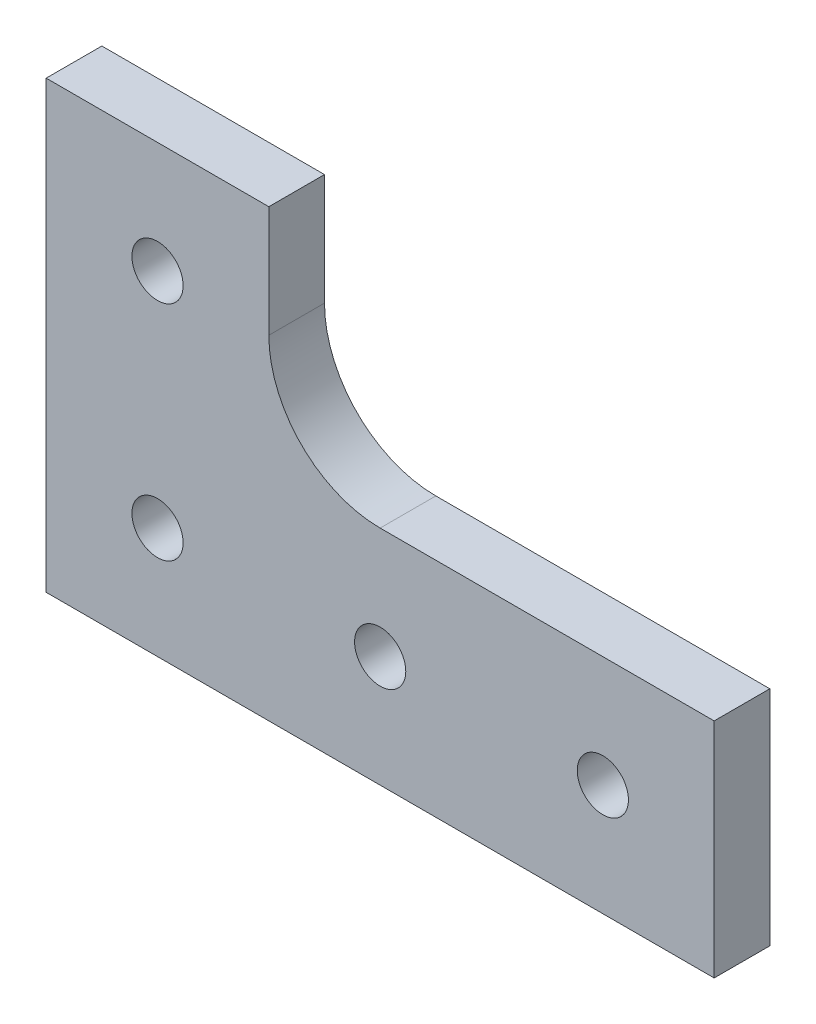
ISO-10303-21;
HEADER;
FILE_DESCRIPTION(('STEP AP214'),'2;1');
FILE_NAME('part.step','',(''),(''),'','','');
FILE_SCHEMA(('AUTOMOTIVE_DESIGN { 1 0 10303 214 1 1 1 1 }'));
ENDSEC;
DATA;
#1=APPLICATION_CONTEXT('core data for automotive mechanical design processes');
#2=APPLICATION_PROTOCOL_DEFINITION('international standard','automotive_design',2000,#1);
#3=PRODUCT_CONTEXT('',#1,'mechanical');
#4=PRODUCT('Part','Part','',(#3));
#5=PRODUCT_RELATED_PRODUCT_CATEGORY('part','',(#4));
#6=PRODUCT_DEFINITION_FORMATION('','',#4);
#7=PRODUCT_DEFINITION_CONTEXT('part definition',#1,'design');
#8=PRODUCT_DEFINITION('design','',#6,#7);
#9=PRODUCT_DEFINITION_SHAPE('','',#8);
#10=(LENGTH_UNIT() NAMED_UNIT(*) SI_UNIT(.MILLI.,.METRE.));
#11=(NAMED_UNIT(*) PLANE_ANGLE_UNIT() SI_UNIT($,.RADIAN.));
#12=(NAMED_UNIT(*) SI_UNIT($,.STERADIAN.) SOLID_ANGLE_UNIT());
#13=UNCERTAINTY_MEASURE_WITH_UNIT(LENGTH_MEASURE(1.E-05),#10,'distance_accuracy_value','');
#14=(GEOMETRIC_REPRESENTATION_CONTEXT(3) GLOBAL_UNCERTAINTY_ASSIGNED_CONTEXT((#13)) GLOBAL_UNIT_ASSIGNED_CONTEXT((#10,
#11,#12)) REPRESENTATION_CONTEXT('',''));
#15=CARTESIAN_POINT('',(0.,0.,0.));
#16=DIRECTION('',(0.,0.,1.));
#17=DIRECTION('',(1.,0.,0.));
#18=AXIS2_PLACEMENT_3D('',#15,#16,#17);
#19=CARTESIAN_POINT('',(76.2,0.,6.35));
#20=DIRECTION('',(0.,1.,0.));
#21=DIRECTION('',(-1.,0.,0.));
#22=AXIS2_PLACEMENT_3D('',#19,#20,#21);
#23=PLANE('',#22);
#24=DIRECTION('',(1.,0.,0.));
#25=VECTOR('',#24,1.);
#26=CARTESIAN_POINT('',(76.2,0.,0.));
#27=LINE('',#26,#25);
#28=CARTESIAN_POINT('',(0.,0.,0.));
#29=VERTEX_POINT('',#28);
#30=CARTESIAN_POINT('',(76.2,0.,0.));
#31=VERTEX_POINT('',#30);
#32=EDGE_CURVE('E123',#29,#31,#27,.T.);
#33=ORIENTED_EDGE('',*,*,#32,.T.);
#34=DIRECTION('',(0.,0.,-1.));
#35=VECTOR('',#34,1.);
#36=CARTESIAN_POINT('',(76.2,0.,6.35));
#37=LINE('',#36,#35);
#38=CARTESIAN_POINT('',(76.2,0.,6.35));
#39=VERTEX_POINT('',#38);
#40=EDGE_CURVE('E103',#39,#31,#37,.T.);
#41=ORIENTED_EDGE('',*,*,#40,.F.);
#42=DIRECTION('',(1.,0.,0.));
#43=VECTOR('',#42,1.);
#44=CARTESIAN_POINT('',(76.2,0.,6.35));
#45=LINE('',#44,#43);
#46=CARTESIAN_POINT('',(0.,0.,6.35));
#47=VERTEX_POINT('',#46);
#48=EDGE_CURVE('E110',#47,#39,#45,.T.);
#49=ORIENTED_EDGE('',*,*,#48,.F.);
#50=DIRECTION('',(0.,0.,-1.));
#51=VECTOR('',#50,1.);
#52=CARTESIAN_POINT('',(0.,0.,6.35));
#53=LINE('',#52,#51);
#54=EDGE_CURVE('E144',#47,#29,#53,.T.);
#55=ORIENTED_EDGE('',*,*,#54,.T.);
#56=EDGE_LOOP('',(#33,#41,#49,#55));
#57=FACE_BOUND('',#56,.T.);
#58=ADVANCED_FACE('F39',(#57),#23,.F.);
#59=CARTESIAN_POINT('',(76.2,25.4,6.35));
#60=DIRECTION('',(-1.,0.,0.));
#61=DIRECTION('',(0.,0.,1.));
#62=AXIS2_PLACEMENT_3D('',#59,#60,#61);
#63=PLANE('',#62);
#64=DIRECTION('',(0.,1.,0.));
#65=VECTOR('',#64,1.);
#66=CARTESIAN_POINT('',(76.2,25.4,0.));
#67=LINE('',#66,#65);
#68=CARTESIAN_POINT('',(76.2,25.4,0.));
#69=VERTEX_POINT('',#68);
#70=EDGE_CURVE('E158',#31,#69,#67,.T.);
#71=ORIENTED_EDGE('',*,*,#70,.T.);
#72=DIRECTION('',(0.,0.,-1.));
#73=VECTOR('',#72,1.);
#74=CARTESIAN_POINT('',(76.2,25.4,6.35));
#75=LINE('',#74,#73);
#76=CARTESIAN_POINT('',(76.2,25.4,6.35));
#77=VERTEX_POINT('',#76);
#78=EDGE_CURVE('E106',#77,#69,#75,.T.);
#79=ORIENTED_EDGE('',*,*,#78,.F.);
#80=DIRECTION('',(0.,1.,0.));
#81=VECTOR('',#80,1.);
#82=CARTESIAN_POINT('',(76.2,25.4,6.35));
#83=LINE('',#82,#81);
#84=EDGE_CURVE('E99',#39,#77,#83,.T.);
#85=ORIENTED_EDGE('',*,*,#84,.F.);
#86=ORIENTED_EDGE('',*,*,#40,.T.);
#87=EDGE_LOOP('',(#71,#79,#85,#86));
#88=FACE_BOUND('',#87,.T.);
#89=ADVANCED_FACE('F101',(#88),#63,.F.);
#90=CARTESIAN_POINT('',(25.4,25.4,6.35));
#91=DIRECTION('',(0.,-1.,0.));
#92=DIRECTION('',(1.,0.,0.));
#93=AXIS2_PLACEMENT_3D('',#90,#91,#92);
#94=PLANE('',#93);
#95=DIRECTION('',(-1.,0.,0.));
#96=VECTOR('',#95,1.);
#97=CARTESIAN_POINT('',(25.4,25.4,0.));
#98=LINE('',#97,#96);
#99=CARTESIAN_POINT('',(38.1,25.4,0.));
#100=VERTEX_POINT('',#99);
#101=EDGE_CURVE('E155',#69,#100,#98,.T.);
#102=ORIENTED_EDGE('',*,*,#101,.T.);
#103=DIRECTION('',(0.,0.,-1.));
#104=VECTOR('',#103,1.);
#105=CARTESIAN_POINT('',(38.1,25.4,6.35));
#106=LINE('',#105,#104);
#107=CARTESIAN_POINT('',(38.1,25.4,6.35));
#108=VERTEX_POINT('',#107);
#109=EDGE_CURVE('E55',#100,#108,#106,.F.);
#110=ORIENTED_EDGE('',*,*,#109,.T.);
#111=DIRECTION('',(-1.,0.,0.));
#112=VECTOR('',#111,1.);
#113=CARTESIAN_POINT('',(25.4,25.4,6.35));
#114=LINE('',#113,#112);
#115=EDGE_CURVE('E109',#77,#108,#114,.T.);
#116=ORIENTED_EDGE('',*,*,#115,.F.);
#117=ORIENTED_EDGE('',*,*,#78,.T.);
#118=EDGE_LOOP('',(#102,#110,#116,#117));
#119=FACE_BOUND('',#118,.T.);
#120=ADVANCED_FACE('F243',(#119),#94,.F.);
#121=CARTESIAN_POINT('',(25.4,50.8,6.35));
#122=DIRECTION('',(-1.,0.,0.));
#123=DIRECTION('',(0.,-1.,0.));
#124=AXIS2_PLACEMENT_3D('',#121,#122,#123);
#125=PLANE('',#124);
#126=DIRECTION('',(0.,1.,0.));
#127=VECTOR('',#126,1.);
#128=CARTESIAN_POINT('',(25.4,50.8,6.35));
#129=LINE('',#128,#127);
#130=CARTESIAN_POINT('',(25.4,38.1,6.35));
#131=VERTEX_POINT('',#130);
#132=CARTESIAN_POINT('',(25.4,50.8,6.35));
#133=VERTEX_POINT('',#132);
#134=EDGE_CURVE('E169',#131,#133,#129,.T.);
#135=ORIENTED_EDGE('',*,*,#134,.F.);
#136=DIRECTION('',(0.,0.,-1.));
#137=VECTOR('',#136,1.);
#138=CARTESIAN_POINT('',(25.4,38.1,0.));
#139=LINE('',#138,#137);
#140=CARTESIAN_POINT('',(25.4,38.1,0.));
#141=VERTEX_POINT('',#140);
#142=EDGE_CURVE('E125',#131,#141,#139,.T.);
#143=ORIENTED_EDGE('',*,*,#142,.T.);
#144=DIRECTION('',(0.,1.,0.));
#145=VECTOR('',#144,1.);
#146=CARTESIAN_POINT('',(25.4,50.8,0.));
#147=LINE('',#146,#145);
#148=CARTESIAN_POINT('',(25.4,50.8,0.));
#149=VERTEX_POINT('',#148);
#150=EDGE_CURVE('E152',#141,#149,#147,.T.);
#151=ORIENTED_EDGE('',*,*,#150,.T.);
#152=DIRECTION('',(0.,0.,-1.));
#153=VECTOR('',#152,1.);
#154=CARTESIAN_POINT('',(25.4,50.8,6.35));
#155=LINE('',#154,#153);
#156=EDGE_CURVE('E131',#133,#149,#155,.T.);
#157=ORIENTED_EDGE('',*,*,#156,.F.);
#158=EDGE_LOOP('',(#135,#143,#151,#157));
#159=FACE_BOUND('',#158,.T.);
#160=ADVANCED_FACE('F248',(#159),#125,.F.);
#161=CARTESIAN_POINT('',(0.,50.8,6.35));
#162=DIRECTION('',(0.,-1.,0.));
#163=DIRECTION('',(0.,0.,-1.));
#164=AXIS2_PLACEMENT_3D('',#161,#162,#163);
#165=PLANE('',#164);
#166=DIRECTION('',(-1.,0.,0.));
#167=VECTOR('',#166,1.);
#168=CARTESIAN_POINT('',(0.,50.8,0.));
#169=LINE('',#168,#167);
#170=CARTESIAN_POINT('',(0.,50.8,0.));
#171=VERTEX_POINT('',#170);
#172=EDGE_CURVE('E149',#149,#171,#169,.T.);
#173=ORIENTED_EDGE('',*,*,#172,.T.);
#174=DIRECTION('',(0.,0.,-1.));
#175=VECTOR('',#174,1.);
#176=CARTESIAN_POINT('',(0.,50.8,6.35));
#177=LINE('',#176,#175);
#178=CARTESIAN_POINT('',(0.,50.8,6.35));
#179=VERTEX_POINT('',#178);
#180=EDGE_CURVE('E140',#179,#171,#177,.T.);
#181=ORIENTED_EDGE('',*,*,#180,.F.);
#182=DIRECTION('',(-1.,0.,0.));
#183=VECTOR('',#182,1.);
#184=CARTESIAN_POINT('',(0.,50.8,6.35));
#185=LINE('',#184,#183);
#186=EDGE_CURVE('E166',#133,#179,#185,.T.);
#187=ORIENTED_EDGE('',*,*,#186,.F.);
#188=ORIENTED_EDGE('',*,*,#156,.T.);
#189=EDGE_LOOP('',(#173,#181,#187,#188));
#190=FACE_BOUND('',#189,.T.);
#191=ADVANCED_FACE('F251',(#190),#165,.F.);
#192=CARTESIAN_POINT('',(0.,0.,6.35));
#193=DIRECTION('',(1.,0.,0.));
#194=DIRECTION('',(0.,0.,-1.));
#195=AXIS2_PLACEMENT_3D('',#192,#193,#194);
#196=PLANE('',#195);
#197=DIRECTION('',(0.,-1.,0.));
#198=VECTOR('',#197,1.);
#199=CARTESIAN_POINT('',(0.,0.,0.));
#200=LINE('',#199,#198);
#201=EDGE_CURVE('E120',#171,#29,#200,.T.);
#202=ORIENTED_EDGE('',*,*,#201,.T.);
#203=ORIENTED_EDGE('',*,*,#54,.F.);
#204=DIRECTION('',(0.,-1.,0.));
#205=VECTOR('',#204,1.);
#206=CARTESIAN_POINT('',(0.,0.,6.35));
#207=LINE('',#206,#205);
#208=EDGE_CURVE('E115',#179,#47,#207,.T.);
#209=ORIENTED_EDGE('',*,*,#208,.F.);
#210=ORIENTED_EDGE('',*,*,#180,.T.);
#211=EDGE_LOOP('',(#202,#203,#209,#210));
#212=FACE_BOUND('',#211,.T.);
#213=ADVANCED_FACE('F218',(#212),#196,.F.);
#214=CARTESIAN_POINT('',(0.,0.,6.35));
#215=DIRECTION('',(0.,0.,-1.));
#216=DIRECTION('',(-1.,0.,0.));
#217=AXIS2_PLACEMENT_3D('',#214,#215,#216);
#218=PLANE('',#217);
#219=CARTESIAN_POINT('',(12.7,38.1,6.35));
#220=DIRECTION('',(0.,0.,1.));
#221=DIRECTION('',(1.,0.,0.));
#222=AXIS2_PLACEMENT_3D('',#219,#220,#221);
#223=CIRCLE('',#222,2.921);
#224=CARTESIAN_POINT('',(15.621,38.1,6.35));
#225=VERTEX_POINT('',#224);
#226=EDGE_CURVE('E198',#225,#225,#223,.T.);
#227=ORIENTED_EDGE('',*,*,#226,.F.);
#228=EDGE_LOOP('',(#227));
#229=FACE_BOUND('',#228,.T.);
#230=CARTESIAN_POINT('',(12.7,12.7,6.35));
#231=DIRECTION('',(0.,0.,1.));
#232=DIRECTION('',(1.,0.,0.));
#233=AXIS2_PLACEMENT_3D('',#230,#231,#232);
#234=CIRCLE('',#233,2.921);
#235=CARTESIAN_POINT('',(15.621,12.7,6.35));
#236=VERTEX_POINT('',#235);
#237=EDGE_CURVE('E190',#236,#236,#234,.T.);
#238=ORIENTED_EDGE('',*,*,#237,.F.);
#239=EDGE_LOOP('',(#238));
#240=FACE_BOUND('',#239,.T.);
#241=CARTESIAN_POINT('',(38.1,12.7,6.35));
#242=DIRECTION('',(0.,0.,1.));
#243=DIRECTION('',(1.,0.,0.));
#244=AXIS2_PLACEMENT_3D('',#241,#242,#243);
#245=CIRCLE('',#244,2.921);
#246=CARTESIAN_POINT('',(41.021,12.7,6.35));
#247=VERTEX_POINT('',#246);
#248=EDGE_CURVE('E182',#247,#247,#245,.T.);
#249=ORIENTED_EDGE('',*,*,#248,.F.);
#250=EDGE_LOOP('',(#249));
#251=FACE_BOUND('',#250,.T.);
#252=CARTESIAN_POINT('',(63.5,12.7,6.35));
#253=DIRECTION('',(0.,0.,1.));
#254=DIRECTION('',(1.,0.,0.));
#255=AXIS2_PLACEMENT_3D('',#252,#253,#254);
#256=CIRCLE('',#255,2.92100000000001);
#257=CARTESIAN_POINT('',(66.421,12.7,6.35));
#258=VERTEX_POINT('',#257);
#259=EDGE_CURVE('E174',#258,#258,#256,.T.);
#260=ORIENTED_EDGE('',*,*,#259,.F.);
#261=EDGE_LOOP('',(#260));
#262=FACE_BOUND('',#261,.T.);
#263=ORIENTED_EDGE('',*,*,#48,.T.);
#264=ORIENTED_EDGE('',*,*,#84,.T.);
#265=ORIENTED_EDGE('',*,*,#115,.T.);
#266=CARTESIAN_POINT('',(38.1,38.1,6.35));
#267=DIRECTION('',(0.,0.,-1.));
#268=DIRECTION('',(-1.,0.,0.));
#269=AXIS2_PLACEMENT_3D('',#266,#267,#268);
#270=CIRCLE('',#269,12.7);
#271=EDGE_CURVE('E11',#108,#131,#270,.T.);
#272=ORIENTED_EDGE('',*,*,#271,.T.);
#273=ORIENTED_EDGE('',*,*,#134,.T.);
#274=ORIENTED_EDGE('',*,*,#186,.T.);
#275=ORIENTED_EDGE('',*,*,#208,.T.);
#276=EDGE_LOOP('',(#263,#264,#265,#272,#273,#274,#275));
#277=FACE_BOUND('',#276,.T.);
#278=ADVANCED_FACE('F113',(#229,#240,#251,#262,#277),#218,.F.);
#279=CARTESIAN_POINT('',(0.,0.,0.));
#280=DIRECTION('',(0.,0.,-1.));
#281=DIRECTION('',(-1.,0.,0.));
#282=AXIS2_PLACEMENT_3D('',#279,#280,#281);
#283=PLANE('',#282);
#284=CARTESIAN_POINT('',(12.7,38.1,0.));
#285=DIRECTION('',(0.,0.,1.));
#286=DIRECTION('',(1.,0.,0.));
#287=AXIS2_PLACEMENT_3D('',#284,#285,#286);
#288=CIRCLE('',#287,2.921);
#289=CARTESIAN_POINT('',(15.621,38.1,0.));
#290=VERTEX_POINT('',#289);
#291=EDGE_CURVE('E163',#290,#290,#288,.T.);
#292=ORIENTED_EDGE('',*,*,#291,.T.);
#293=EDGE_LOOP('',(#292));
#294=FACE_BOUND('',#293,.T.);
#295=CARTESIAN_POINT('',(12.7,12.7,0.));
#296=DIRECTION('',(0.,0.,1.));
#297=DIRECTION('',(1.,0.,0.));
#298=AXIS2_PLACEMENT_3D('',#295,#296,#297);
#299=CIRCLE('',#298,2.921);
#300=CARTESIAN_POINT('',(15.621,12.7,0.));
#301=VERTEX_POINT('',#300);
#302=EDGE_CURVE('E194',#301,#301,#299,.T.);
#303=ORIENTED_EDGE('',*,*,#302,.T.);
#304=EDGE_LOOP('',(#303));
#305=FACE_BOUND('',#304,.T.);
#306=CARTESIAN_POINT('',(38.1,12.7,0.));
#307=DIRECTION('',(0.,0.,1.));
#308=DIRECTION('',(1.,0.,0.));
#309=AXIS2_PLACEMENT_3D('',#306,#307,#308);
#310=CIRCLE('',#309,2.921);
#311=CARTESIAN_POINT('',(41.021,12.7,0.));
#312=VERTEX_POINT('',#311);
#313=EDGE_CURVE('E186',#312,#312,#310,.T.);
#314=ORIENTED_EDGE('',*,*,#313,.T.);
#315=EDGE_LOOP('',(#314));
#316=FACE_BOUND('',#315,.T.);
#317=CARTESIAN_POINT('',(63.5,12.7,0.));
#318=DIRECTION('',(0.,0.,1.));
#319=DIRECTION('',(1.,0.,0.));
#320=AXIS2_PLACEMENT_3D('',#317,#318,#319);
#321=CIRCLE('',#320,2.92100000000001);
#322=CARTESIAN_POINT('',(66.421,12.7,0.));
#323=VERTEX_POINT('',#322);
#324=EDGE_CURVE('E178',#323,#323,#321,.T.);
#325=ORIENTED_EDGE('',*,*,#324,.T.);
#326=EDGE_LOOP('',(#325));
#327=FACE_BOUND('',#326,.T.);
#328=ORIENTED_EDGE('',*,*,#32,.F.);
#329=ORIENTED_EDGE('',*,*,#201,.F.);
#330=ORIENTED_EDGE('',*,*,#172,.F.);
#331=ORIENTED_EDGE('',*,*,#150,.F.);
#332=CARTESIAN_POINT('',(38.1,38.1,0.));
#333=DIRECTION('',(0.,0.,-1.));
#334=DIRECTION('',(-1.,0.,0.));
#335=AXIS2_PLACEMENT_3D('',#332,#333,#334);
#336=CIRCLE('',#335,12.7);
#337=EDGE_CURVE('E48',#141,#100,#336,.F.);
#338=ORIENTED_EDGE('',*,*,#337,.T.);
#339=ORIENTED_EDGE('',*,*,#101,.F.);
#340=ORIENTED_EDGE('',*,*,#70,.F.);
#341=EDGE_LOOP('',(#328,#329,#330,#331,#338,#339,#340));
#342=FACE_BOUND('',#341,.T.);
#343=ADVANCED_FACE('F206',(#294,#305,#316,#327,#342),#283,.T.);
#344=CARTESIAN_POINT('',(63.5,12.7,0.));
#345=DIRECTION('',(0.,0.,1.));
#346=DIRECTION('',(1.,0.,0.));
#347=AXIS2_PLACEMENT_3D('',#344,#345,#346);
#348=CYLINDRICAL_SURFACE('',#347,2.92100000000001);
#349=ORIENTED_EDGE('',*,*,#324,.F.);
#350=EDGE_LOOP('',(#349));
#351=FACE_BOUND('',#350,.T.);
#352=ORIENTED_EDGE('',*,*,#259,.T.);
#353=EDGE_LOOP('',(#352));
#354=FACE_BOUND('',#353,.T.);
#355=ADVANCED_FACE('F226',(#351,#354),#348,.F.);
#356=CARTESIAN_POINT('',(38.1,12.7,0.));
#357=DIRECTION('',(0.,0.,1.));
#358=DIRECTION('',(1.,0.,0.));
#359=AXIS2_PLACEMENT_3D('',#356,#357,#358);
#360=CYLINDRICAL_SURFACE('',#359,2.921);
#361=ORIENTED_EDGE('',*,*,#313,.F.);
#362=EDGE_LOOP('',(#361));
#363=FACE_BOUND('',#362,.T.);
#364=ORIENTED_EDGE('',*,*,#248,.T.);
#365=EDGE_LOOP('',(#364));
#366=FACE_BOUND('',#365,.T.);
#367=ADVANCED_FACE('F228',(#363,#366),#360,.F.);
#368=CARTESIAN_POINT('',(12.7,12.7,0.));
#369=DIRECTION('',(0.,0.,1.));
#370=DIRECTION('',(1.,0.,0.));
#371=AXIS2_PLACEMENT_3D('',#368,#369,#370);
#372=CYLINDRICAL_SURFACE('',#371,2.921);
#373=ORIENTED_EDGE('',*,*,#302,.F.);
#374=EDGE_LOOP('',(#373));
#375=FACE_BOUND('',#374,.T.);
#376=ORIENTED_EDGE('',*,*,#237,.T.);
#377=EDGE_LOOP('',(#376));
#378=FACE_BOUND('',#377,.T.);
#379=ADVANCED_FACE('F212',(#375,#378),#372,.F.);
#380=CARTESIAN_POINT('',(12.7,38.1,0.));
#381=DIRECTION('',(0.,0.,1.));
#382=DIRECTION('',(1.,0.,0.));
#383=AXIS2_PLACEMENT_3D('',#380,#381,#382);
#384=CYLINDRICAL_SURFACE('',#383,2.921);
#385=ORIENTED_EDGE('',*,*,#291,.F.);
#386=EDGE_LOOP('',(#385));
#387=FACE_BOUND('',#386,.T.);
#388=ORIENTED_EDGE('',*,*,#226,.T.);
#389=EDGE_LOOP('',(#388));
#390=FACE_BOUND('',#389,.T.);
#391=ADVANCED_FACE('F209',(#387,#390),#384,.F.);
#392=CARTESIAN_POINT('',(38.1,38.1,6.35));
#393=DIRECTION('',(0.,0.,1.));
#394=DIRECTION('',(1.,0.,0.));
#395=AXIS2_PLACEMENT_3D('',#392,#393,#394);
#396=CYLINDRICAL_SURFACE('',#395,12.7);
#397=ORIENTED_EDGE('',*,*,#271,.F.);
#398=ORIENTED_EDGE('',*,*,#109,.F.);
#399=ORIENTED_EDGE('',*,*,#337,.F.);
#400=ORIENTED_EDGE('',*,*,#142,.F.);
#401=EDGE_LOOP('',(#397,#398,#399,#400));
#402=FACE_BOUND('',#401,.T.);
#403=ADVANCED_FACE('F41',(#402),#396,.F.);
#404=CLOSED_SHELL('',(#58,#89,#120,#160,#191,#213,#278,#343,#355,#367,#379,#391,#403));
#405=MANIFOLD_SOLID_BREP('B2',#404);
#406=ADVANCED_BREP_SHAPE_REPRESENTATION('',(#18,#405),#14);
#407=SHAPE_DEFINITION_REPRESENTATION(#9,#406);
ENDSEC;
END-ISO-10303-21;
